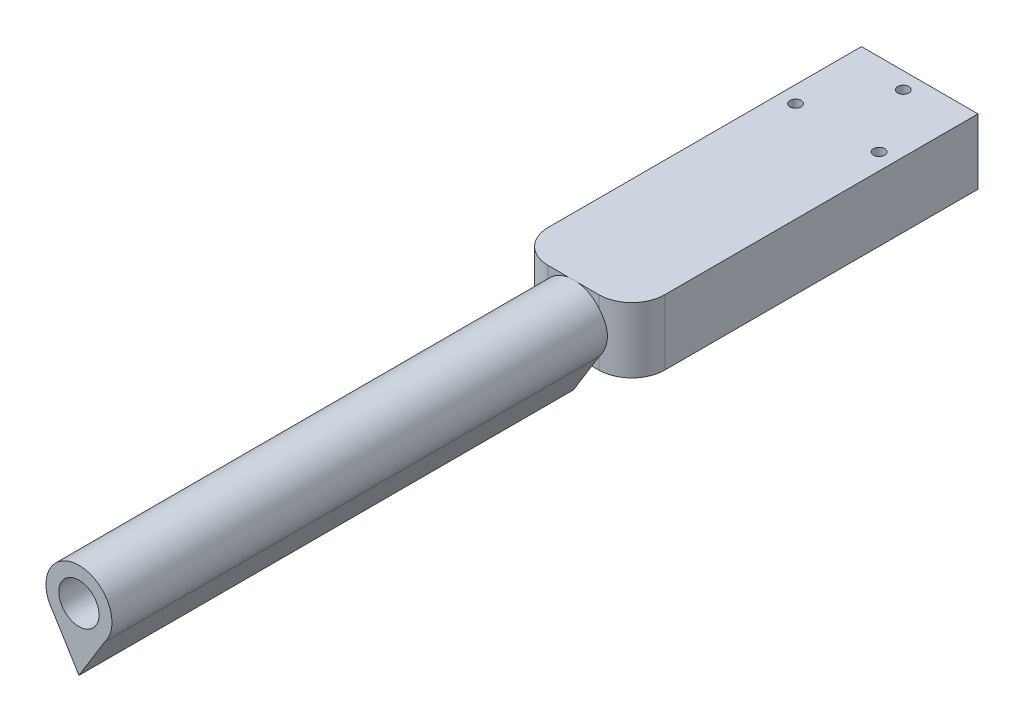
ISO-10303-21;
HEADER;
FILE_DESCRIPTION(('STEP AP214'),'2;1');
FILE_NAME('part.step','',(''),(''),'','','');
FILE_SCHEMA(('AUTOMOTIVE_DESIGN { 1 0 10303 214 1 1 1 1 }'));
ENDSEC;
DATA;
#1=APPLICATION_CONTEXT('core data for automotive mechanical design processes');
#2=APPLICATION_PROTOCOL_DEFINITION('international standard','automotive_design',2000,#1);
#3=PRODUCT_CONTEXT('',#1,'mechanical');
#4=PRODUCT('Part','Part','',(#3));
#5=PRODUCT_RELATED_PRODUCT_CATEGORY('part','',(#4));
#6=PRODUCT_DEFINITION_FORMATION('','',#4);
#7=PRODUCT_DEFINITION_CONTEXT('part definition',#1,'design');
#8=PRODUCT_DEFINITION('design','',#6,#7);
#9=PRODUCT_DEFINITION_SHAPE('','',#8);
#10=(LENGTH_UNIT() NAMED_UNIT(*) SI_UNIT(.MILLI.,.METRE.));
#11=(NAMED_UNIT(*) PLANE_ANGLE_UNIT() SI_UNIT($,.RADIAN.));
#12=(NAMED_UNIT(*) SI_UNIT($,.STERADIAN.) SOLID_ANGLE_UNIT());
#13=UNCERTAINTY_MEASURE_WITH_UNIT(LENGTH_MEASURE(1.E-05),#10,'distance_accuracy_value','');
#14=(GEOMETRIC_REPRESENTATION_CONTEXT(3) GLOBAL_UNCERTAINTY_ASSIGNED_CONTEXT((#13)) GLOBAL_UNIT_ASSIGNED_CONTEXT((#10,
#11,#12)) REPRESENTATION_CONTEXT('',''));
#15=CARTESIAN_POINT('',(0.,0.,0.));
#16=DIRECTION('',(0.,0.,1.));
#17=DIRECTION('',(1.,0.,0.));
#18=AXIS2_PLACEMENT_3D('',#15,#16,#17);
#19=CARTESIAN_POINT('',(0.,0.,0.));
#20=DIRECTION('',(0.,0.,1.));
#21=DIRECTION('',(1.,0.,0.));
#22=AXIS2_PLACEMENT_3D('',#19,#20,#21);
#23=PLANE('',#22);
#24=DIRECTION('',(1.,0.,0.));
#25=VECTOR('',#24,1.);
#26=CARTESIAN_POINT('',(-17.6733997966207,-9.90054579100179,0.));
#27=LINE('',#26,#25);
#28=CARTESIAN_POINT('',(5.54031802648525,-9.90054579100179,0.));
#29=VERTEX_POINT('',#28);
#30=CARTESIAN_POINT('',(7.67339979662072,-9.90054579100179,0.));
#31=VERTEX_POINT('',#30);
#32=EDGE_CURVE('E176',#29,#31,#27,.T.);
#33=ORIENTED_EDGE('',*,*,#32,.T.);
#34=DIRECTION('',(0.,1.,0.));
#35=VECTOR('',#34,1.);
#36=CARTESIAN_POINT('',(7.67339979662073,0.,0.));
#37=LINE('',#36,#35);
#38=CARTESIAN_POINT('',(7.67339979662073,-6.42417658757995,0.));
#39=VERTEX_POINT('',#38);
#40=EDGE_CURVE('E262',#31,#39,#37,.T.);
#41=ORIENTED_EDGE('',*,*,#40,.T.);
#42=DIRECTION('',(0.522990431327219,0.852338552888563,0.));
#43=VECTOR('',#42,1.);
#44=CARTESIAN_POINT('',(0.,-18.9298250404386,0.));
#45=LINE('',#44,#43);
#46=EDGE_CURVE('E205',#29,#39,#45,.T.);
#47=ORIENTED_EDGE('',*,*,#46,.F.);
#48=EDGE_LOOP('',(#33,#41,#47));
#49=FACE_BOUND('',#48,.T.);
#50=ADVANCED_FACE('F39',(#49),#23,.T.);
#51=DIRECTION('',(-1.,0.,0.));
#52=VECTOR('',#51,1.);
#53=CARTESIAN_POINT('',(-17.6733997966207,9.90054579100179,0.));
#54=LINE('',#53,#52);
#55=CARTESIAN_POINT('',(-1.4068379580736,9.90054579100179,0.));
#56=VERTEX_POINT('',#55);
#57=CARTESIAN_POINT('',(-7.67339979662073,9.90054579100179,0.));
#58=VERTEX_POINT('',#57);
#59=EDGE_CURVE('E190',#56,#58,#54,.T.);
#60=ORIENTED_EDGE('',*,*,#59,.T.);
#61=DIRECTION('',(0.,-1.,0.));
#62=VECTOR('',#61,1.);
#63=CARTESIAN_POINT('',(-7.67339979662073,0.,0.));
#64=LINE('',#63,#62);
#65=CARTESIAN_POINT('',(-7.67339979662073,6.41240481888199,0.));
#66=VERTEX_POINT('',#65);
#67=EDGE_CURVE('E241',#58,#66,#64,.T.);
#68=ORIENTED_EDGE('',*,*,#67,.T.);
#69=CARTESIAN_POINT('',(0.,0.,0.));
#70=DIRECTION('',(0.,0.,1.));
#71=DIRECTION('',(1.,0.,0.));
#72=AXIS2_PLACEMENT_3D('',#69,#70,#71);
#73=CIRCLE('',#72,10.);
#74=EDGE_CURVE('E222',#56,#66,#73,.T.);
#75=ORIENTED_EDGE('',*,*,#74,.F.);
#76=EDGE_LOOP('',(#60,#68,#75));
#77=FACE_BOUND('',#76,.T.);
#78=ADVANCED_FACE('F302',(#77),#23,.T.);
#79=CARTESIAN_POINT('',(0.,0.,0.));
#80=DIRECTION('',(0.,0.,1.));
#81=DIRECTION('',(1.,0.,0.));
#82=AXIS2_PLACEMENT_3D('',#79,#80,#81);
#83=PLANE('',#82);
#84=CARTESIAN_POINT('',(1.4068379580736,9.90054579100179,0.));
#85=VERTEX_POINT('',#84);
#86=EDGE_CURVE('E227',#85,#56,#73,.T.);
#87=ORIENTED_EDGE('',*,*,#86,.F.);
#88=EDGE_CURVE('E191',#85,#56,#54,.T.);
#89=ORIENTED_EDGE('',*,*,#88,.T.);
#90=EDGE_LOOP('',(#87,#89));
#91=FACE_BOUND('',#90,.T.);
#92=ADVANCED_FACE('F300',(#91),#83,.F.);
#93=CARTESIAN_POINT('',(0.,0.,150.));
#94=DIRECTION('',(0.,0.,1.));
#95=DIRECTION('',(1.,0.,0.));
#96=AXIS2_PLACEMENT_3D('',#93,#94,#95);
#97=PLANE('',#96);
#98=DIRECTION('',(0.522990431327219,0.852338552888563,0.));
#99=VECTOR('',#98,1.);
#100=CARTESIAN_POINT('',(0.,-18.9298250404386,150.));
#101=LINE('',#100,#99);
#102=CARTESIAN_POINT('',(0.,-18.9298250404386,150.));
#103=VERTEX_POINT('',#102);
#104=CARTESIAN_POINT('',(7.70091379908371,-6.37933591050684,150.));
#105=VERTEX_POINT('',#104);
#106=EDGE_CURVE('E206',#103,#105,#101,.T.);
#107=ORIENTED_EDGE('',*,*,#106,.T.);
#108=CARTESIAN_POINT('',(0.,0.,150.));
#109=DIRECTION('',(0.,0.,1.));
#110=DIRECTION('',(1.,0.,0.));
#111=AXIS2_PLACEMENT_3D('',#108,#109,#110);
#112=CIRCLE('',#111,10.);
#113=CARTESIAN_POINT('',(-7.70091379908371,-6.37933591050684,150.));
#114=VERTEX_POINT('',#113);
#115=EDGE_CURVE('E210',#105,#114,#112,.T.);
#116=ORIENTED_EDGE('',*,*,#115,.T.);
#117=DIRECTION('',(0.522990431327219,-0.852338552888563,0.));
#118=VECTOR('',#117,1.);
#119=CARTESIAN_POINT('',(0.,-18.9298250404386,150.));
#120=LINE('',#119,#118);
#121=EDGE_CURVE('E214',#114,#103,#120,.T.);
#122=ORIENTED_EDGE('',*,*,#121,.T.);
#123=EDGE_LOOP('',(#107,#116,#122));
#124=FACE_BOUND('',#123,.T.);
#125=CARTESIAN_POINT('',(0.,0.,150.));
#126=DIRECTION('',(0.,0.,1.));
#127=DIRECTION('',(1.,0.,0.));
#128=AXIS2_PLACEMENT_3D('',#125,#126,#127);
#129=CIRCLE('',#128,6.1);
#130=CARTESIAN_POINT('',(6.1,0.,150.));
#131=VERTEX_POINT('',#130);
#132=EDGE_CURVE('E195',#131,#131,#129,.T.);
#133=ORIENTED_EDGE('',*,*,#132,.F.);
#134=EDGE_LOOP('',(#133));
#135=FACE_BOUND('',#134,.T.);
#136=ADVANCED_FACE('F297',(#124,#135),#97,.T.);
#137=DIRECTION('',(0.522990431327219,-0.852338552888563,0.));
#138=VECTOR('',#137,1.);
#139=CARTESIAN_POINT('',(0.,-18.9298250404386,0.));
#140=LINE('',#139,#138);
#141=CARTESIAN_POINT('',(-5.54031802648525,-9.90054579100179,0.));
#142=VERTEX_POINT('',#141);
#143=CARTESIAN_POINT('',(0.,-18.9298250404386,0.));
#144=VERTEX_POINT('',#143);
#145=EDGE_CURVE('E226',#142,#144,#140,.T.);
#146=ORIENTED_EDGE('',*,*,#145,.F.);
#147=EDGE_CURVE('E178',#142,#29,#27,.T.);
#148=ORIENTED_EDGE('',*,*,#147,.T.);
#149=EDGE_CURVE('E218',#144,#29,#45,.T.);
#150=ORIENTED_EDGE('',*,*,#149,.F.);
#151=EDGE_LOOP('',(#146,#148,#150));
#152=FACE_BOUND('',#151,.T.);
#153=ADVANCED_FACE('F290',(#152),#83,.F.);
#154=CARTESIAN_POINT('',(0.,-18.9298250404386,150.));
#155=DIRECTION('',(-0.852338552888563,0.522990431327219,0.));
#156=DIRECTION('',(-0.522990431327219,-0.852338552888563,0.));
#157=AXIS2_PLACEMENT_3D('',#154,#155,#156);
#158=PLANE('',#157);
#159=ORIENTED_EDGE('',*,*,#149,.T.);
#160=ORIENTED_EDGE('',*,*,#46,.T.);
#161=CARTESIAN_POINT('',(7.67339979662073,-6.42417658757995,-10.));
#162=DIRECTION('',(-0.852338552888563,0.522990431327219,0.));
#163=DIRECTION('',(0.522990431327219,0.852338552888563,0.));
#164=AXIS2_PLACEMENT_3D('',#161,#162,#163);
#165=ELLIPSE('',#164,19.1208087203862,10.);
#166=CARTESIAN_POINT('',(7.70091379908371,-6.37933591050684,-3.78510882081962E-05));
#167=VERTEX_POINT('',#166);
#168=EDGE_CURVE('E55',#39,#167,#165,.T.);
#169=ORIENTED_EDGE('',*,*,#168,.T.);
#170=DIRECTION('',(0.,0.,-1.));
#171=VECTOR('',#170,1.);
#172=CARTESIAN_POINT('',(7.70091379908371,-6.37933591050684,150.));
#173=LINE('',#172,#171);
#174=EDGE_CURVE('E62',#105,#167,#173,.T.);
#175=ORIENTED_EDGE('',*,*,#174,.F.);
#176=ORIENTED_EDGE('',*,*,#106,.F.);
#177=DIRECTION('',(0.,0.,-1.));
#178=VECTOR('',#177,1.);
#179=CARTESIAN_POINT('',(0.,-18.9298250404386,150.));
#180=LINE('',#179,#178);
#181=EDGE_CURVE('E217',#103,#144,#180,.T.);
#182=ORIENTED_EDGE('',*,*,#181,.T.);
#183=EDGE_LOOP('',(#159,#160,#169,#175,#176,#182));
#184=FACE_BOUND('',#183,.T.);
#185=ADVANCED_FACE('F288',(#184),#158,.F.);
#186=CARTESIAN_POINT('',(0.,0.,150.));
#187=DIRECTION('',(0.,0.,-1.));
#188=DIRECTION('',(-1.,0.,0.));
#189=AXIS2_PLACEMENT_3D('',#186,#187,#188);
#190=CYLINDRICAL_SURFACE('',#189,10.);
#191=ORIENTED_EDGE('',*,*,#174,.T.);
#192=CARTESIAN_POINT('',(7.70091379908372,-6.37933591050683,-3.78510882122295E-05));
#193=CARTESIAN_POINT('',(7.87936989339679,-6.16395895846386,-0.000554831855340775));
#194=CARTESIAN_POINT('',(8.04868272310441,-5.94112849311777,-0.00577241079100746));
#195=CARTESIAN_POINT('',(8.367906607965,-5.48233835746713,-0.0228593364600889));
#196=CARTESIAN_POINT('',(8.51782545323439,-5.24638401352326,-0.0347260021331098));
#197=CARTESIAN_POINT('',(8.79732833358648,-4.76288416023703,-0.0623701454824233));
#198=CARTESIAN_POINT('',(8.9269070163437,-4.51533562216513,-0.0781486497148308));
#199=CARTESIAN_POINT('',(9.16488864665431,-4.01032738352383,-0.111122019981691));
#200=CARTESIAN_POINT('',(9.27328973894412,-3.7528668169738,-0.12831700992));
#201=CARTESIAN_POINT('',(9.46816843174109,-3.22980785978402,-0.161881034200702));
#202=CARTESIAN_POINT('',(9.55465226887144,-2.96421180828778,-0.178250302440476));
#203=CARTESIAN_POINT('',(9.70513482505023,-2.42657673303095,-0.208271453782499));
#204=CARTESIAN_POINT('',(9.76913424907022,-2.15453791156113,-0.221923422076579));
#205=CARTESIAN_POINT('',(9.87411562045391,-1.60614482465541,-0.245014477658921));
#206=CARTESIAN_POINT('',(9.91511974177618,-1.32979498153879,-0.254457621630933));
#207=CARTESIAN_POINT('',(9.97387023729407,-0.77450480997555,-0.268157889977852));
#208=CARTESIAN_POINT('',(9.99161693096563,-0.49556451716569,-0.272415085589549));
#209=CARTESIAN_POINT('',(10.0036674195275,0.061276341905972,-0.27529483157367));
#210=CARTESIAN_POINT('',(9.998102880385,0.339173898110257,-0.273949028938083));
#211=CARTESIAN_POINT('',(9.96387605160388,0.893464377655603,-0.265832070003794));
#212=CARTESIAN_POINT('',(9.93521344376296,1.16985728021553,-0.259060838963633));
#213=CARTESIAN_POINT('',(9.85497970181812,1.71947748479808,-0.240778809714677));
#214=CARTESIAN_POINT('',(9.80338066664673,1.99270051419057,-0.229262240278646));
#215=CARTESIAN_POINT('',(9.67767294047554,2.53372747666002,-0.202704037465773));
#216=CARTESIAN_POINT('',(9.60356498212027,2.80153158581524,-0.18766251882639));
#217=CARTESIAN_POINT('',(9.43379780629884,3.32862501218196,-0.155792933144531));
#218=CARTESIAN_POINT('',(9.33824782183939,3.58795010972474,-0.138974142215204));
#219=CARTESIAN_POINT('',(9.12599502324338,4.09786384574218,-0.105481128038567));
#220=CARTESIAN_POINT('',(9.00928842124407,4.34845091017192,-0.0888069312403349));
#221=CARTESIAN_POINT('',(8.75577896655061,4.83862594139299,-0.0579318510528613));
#222=CARTESIAN_POINT('',(8.61902529683081,5.0782389952485,-0.0437250953490678));
#223=CARTESIAN_POINT('',(8.32612241338853,5.54541240985072,-0.0202451259145894));
#224=CARTESIAN_POINT('',(8.16998659365909,5.77298094052773,-0.0109685283636447));
#225=CARTESIAN_POINT('',(7.95136170719111,6.06496377335967,-0.00372140463528704));
#226=CARTESIAN_POINT('',(7.89704895421227,6.13551549851941,-0.00234854669981117));
#227=CARTESIAN_POINT('',(7.78659557226856,6.27509666932411,-0.000488266956960034));
#228=CARTESIAN_POINT('',(7.73045638338249,6.34412724559906,-1.6398722680454E-07));
#229=CARTESIAN_POINT('',(7.67339979662073,6.41240481888199,0.));
#230=B_SPLINE_CURVE_WITH_KNOTS('',3,(#192,#193,#194,#195,#196,#197,#198,#199,#200,#201,#202,
#203,#204,#205,#206,#207,#208,#209,#210,#211,#212,#213,#214,#215,#216,#217,#218,#219,#220,#221,
#222,#223,#224,#225,#226,#227,#228,#229),.UNSPECIFIED.,.F.,.F.,(4,2,2,2,2,2,2,2,2,2,2,2,2,2,2,2,
2,2,4),(0.,0.838705367373265,1.67707279311276,2.51566045899176,3.35432155646335,
4.19274374167313,5.03113963682443,5.86872568557564,6.70630022869458,7.53915039973668,
8.37201204443604,9.20588960992523,10.0397400363834,10.8694352754144,11.6992792093486,
12.5271202804275,13.3543924255524,13.6215058633422,13.8884135661764),.UNSPECIFIED.);
#231=CARTESIAN_POINT('',(7.67339979662073,6.41240481888199,0.));
#232=VERTEX_POINT('',#231);
#233=EDGE_CURVE('E11',#167,#232,#230,.T.);
#234=ORIENTED_EDGE('',*,*,#233,.T.);
#235=EDGE_CURVE('E223',#232,#85,#73,.T.);
#236=ORIENTED_EDGE('',*,*,#235,.T.);
#237=ORIENTED_EDGE('',*,*,#86,.T.);
#238=ORIENTED_EDGE('',*,*,#74,.T.);
#239=CARTESIAN_POINT('',(-7.67339979662073,6.41240481888199,0.));
#240=CARTESIAN_POINT('',(-7.85271366867811,6.19787860899442,-2.54043405898275E-05));
#241=CARTESIAN_POINT('',(-8.02292666681599,5.97585959978533,-0.0048236266007803));
#242=CARTESIAN_POINT('',(-8.34402163883713,5.51861747921123,-0.0212109039748143));
#243=CARTESIAN_POINT('',(-8.49491164736829,5.28339991480256,-0.0327971253407081));
#244=CARTESIAN_POINT('',(-8.77641385661889,4.80130708961674,-0.0600132184177091));
#245=CARTESIAN_POINT('',(-8.90702156656933,4.55442926283897,-0.0756439836074375));
#246=CARTESIAN_POINT('',(-9.14712018970338,4.05068348729827,-0.108445781585897));
#247=CARTESIAN_POINT('',(-9.25660916942431,3.79381462642037,-0.125616955191504));
#248=CARTESIAN_POINT('',(-9.45371081390576,3.2718719027837,-0.159243416022915));
#249=CARTESIAN_POINT('',(-9.54133105094643,3.00680091592966,-0.175698949412325));
#250=CARTESIAN_POINT('',(-9.69413800468911,2.47012616137426,-0.205986907629425));
#251=CARTESIAN_POINT('',(-9.7593254476979,2.19852260548264,-0.219819417376266));
#252=CARTESIAN_POINT('',(-9.86672825537362,1.65089502841311,-0.243343984726015));
#253=CARTESIAN_POINT('',(-9.90896530154618,1.37487543384088,-0.253039948304487));
#254=CARTESIAN_POINT('',(-9.97021767988208,0.820138003706108,-0.267291141982786));
#255=CARTESIAN_POINT('',(-9.98923331554362,0.541420203456445,-0.271846439269816));
#256=CARTESIAN_POINT('',(-10.003847073728,-0.0153610372136702,-0.275336932677862));
#257=CARTESIAN_POINT('',(-9.99955415442203,-0.293421453867673,-0.274298278468094));
#258=CARTESIAN_POINT('',(-9.96783978646179,-0.84814729553246,-0.266767838079836));
#259=CARTESIAN_POINT('',(-9.94041801076271,-1.12481270076197,-0.260275974792329));
#260=CARTESIAN_POINT('',(-9.86262782230633,-1.67507584229644,-0.24249680084189));
#261=CARTESIAN_POINT('',(-9.81223187362381,-1.94866949256602,-0.231203736749572));
#262=CARTESIAN_POINT('',(-9.6888833006571,-2.49053166973331,-0.205011811873631));
#263=CARTESIAN_POINT('',(-9.61593142319211,-2.7588003726253,-0.190113070476315));
#264=CARTESIAN_POINT('',(-9.44849549277517,-3.28666313130244,-0.158443027343122));
#265=CARTESIAN_POINT('',(-9.35414100440342,-3.54629902545291,-0.141683290992857));
#266=CARTESIAN_POINT('',(-9.14426205827333,-4.0569295079411,-0.108192770942365));
#267=CARTESIAN_POINT('',(-9.02873384071043,-4.30792255215637,-0.0914619929177057));
#268=CARTESIAN_POINT('',(-8.77755100920772,-4.79900998326473,-0.060340799928621));
#269=CARTESIAN_POINT('',(-8.64194517011114,-5.03912899027704,-0.0459448856600405));
#270=CARTESIAN_POINT('',(-8.35130219506661,-5.50741281650832,-0.0219400791807111));
#271=CARTESIAN_POINT('',(-8.19627838591505,-5.73558568366073,-0.0123279261028899));
#272=CARTESIAN_POINT('',(-7.97878920191594,-6.02884272293705,-0.00452197257024397));
#273=CARTESIAN_POINT('',(-7.92451233314225,-6.10000986022343,-0.00300075876986735));
#274=CARTESIAN_POINT('',(-7.81410420299054,-6.24081464798752,-0.000837622218152413));
#275=CARTESIAN_POINT('',(-7.75797442125718,-6.31045344831051,-0.000195014456496192));
#276=CARTESIAN_POINT('',(-7.70091379908372,-6.37933591050683,-3.78510882113234E-05));
#277=B_SPLINE_CURVE_WITH_KNOTS('',3,(#239,#240,#241,#242,#243,#244,#245,#246,#247,#248,#249,
#250,#251,#252,#253,#254,#255,#256,#257,#258,#259,#260,#261,#262,#263,#264,#265,#266,#267,#268,
#269,#270,#271,#272,#273,#274,#275,#276),.UNSPECIFIED.,.F.,.F.,(4,2,2,2,2,2,2,2,2,2,2,2,2,2,2,2,
2,2,4),(0.,0.838384844150862,1.67641994161967,2.51464032738785,3.35293741754865,
4.19094383463766,5.0289231170316,5.86610936820531,6.70328467744087,7.53654990625777,
8.36982691774135,9.20410529826876,10.0383560590778,10.8676852884212,11.6971619241156,
12.5246555953173,13.3515844274124,13.6201045355373,13.8884151707846),.UNSPECIFIED.);
#278=CARTESIAN_POINT('',(-7.70091379908371,-6.37933591050684,-3.78510882081962E-05));
#279=VERTEX_POINT('',#278);
#280=EDGE_CURVE('E269',#66,#279,#277,.T.);
#281=ORIENTED_EDGE('',*,*,#280,.T.);
#282=DIRECTION('',(0.,0.,-1.));
#283=VECTOR('',#282,1.);
#284=CARTESIAN_POINT('',(-7.70091379908371,-6.37933591050684,150.));
#285=LINE('',#284,#283);
#286=EDGE_CURVE('E70',#114,#279,#285,.T.);
#287=ORIENTED_EDGE('',*,*,#286,.F.);
#288=ORIENTED_EDGE('',*,*,#115,.F.);
#289=EDGE_LOOP('',(#191,#234,#236,#237,#238,#281,#287,#288));
#290=FACE_BOUND('',#289,.T.);
#291=ADVANCED_FACE('F279',(#290),#190,.T.);
#292=CARTESIAN_POINT('',(0.,-18.9298250404386,150.));
#293=DIRECTION('',(0.852338552888563,0.522990431327219,0.));
#294=DIRECTION('',(-0.522990431327219,0.852338552888563,0.));
#295=AXIS2_PLACEMENT_3D('',#292,#293,#294);
#296=PLANE('',#295);
#297=ORIENTED_EDGE('',*,*,#286,.T.);
#298=CARTESIAN_POINT('',(-7.67339979662073,-6.42417658757995,-10.));
#299=DIRECTION('',(0.852338552888563,0.522990431327219,0.));
#300=DIRECTION('',(0.522990431327219,-0.852338552888563,0.));
#301=AXIS2_PLACEMENT_3D('',#298,#299,#300);
#302=ELLIPSE('',#301,19.1208087203862,10.);
#303=CARTESIAN_POINT('',(-7.67339979662073,-6.42417658757995,0.));
#304=VERTEX_POINT('',#303);
#305=EDGE_CURVE('E277',#279,#304,#302,.T.);
#306=ORIENTED_EDGE('',*,*,#305,.T.);
#307=EDGE_CURVE('E211',#304,#142,#140,.T.);
#308=ORIENTED_EDGE('',*,*,#307,.T.);
#309=ORIENTED_EDGE('',*,*,#145,.T.);
#310=ORIENTED_EDGE('',*,*,#181,.F.);
#311=ORIENTED_EDGE('',*,*,#121,.F.);
#312=EDGE_LOOP('',(#297,#306,#308,#309,#310,#311));
#313=FACE_BOUND('',#312,.T.);
#314=ADVANCED_FACE('F296',(#313),#296,.F.);
#315=CARTESIAN_POINT('',(0.,0.,150.));
#316=DIRECTION('',(0.,0.,-1.));
#317=DIRECTION('',(-1.,0.,0.));
#318=AXIS2_PLACEMENT_3D('',#315,#316,#317);
#319=CYLINDRICAL_SURFACE('',#318,6.1);
#320=CARTESIAN_POINT('',(0.,-6.1,-98.3));
#321=CARTESIAN_POINT('',(0.0935574415738143,-6.09999876401496,-98.3000018753178));
#322=CARTESIAN_POINT('',(0.187134436963483,-6.09782664892021,-98.3077490368175));
#323=CARTESIAN_POINT('',(0.371582423304989,-6.08937300816777,-98.3384716806755));
#324=CARTESIAN_POINT('',(0.462452269532269,-6.08308976919173,-98.3614535121626));
#325=CARTESIAN_POINT('',(0.638797647686676,-6.06710564565073,-98.4218325382741));
#326=CARTESIAN_POINT('',(0.724280307472877,-6.05740939379312,-98.4592101989357));
#327=CARTESIAN_POINT('',(0.887764336862142,-6.03561802149456,-98.5472447345298));
#328=CARTESIAN_POINT('',(0.965765027767924,-6.02352268373472,-98.59790281259));
#329=CARTESIAN_POINT('',(1.11403096453056,-5.997893695038,-98.7124033388694));
#330=CARTESIAN_POINT('',(1.1840814698636,-5.98433370971813,-98.776517956963));
#331=CARTESIAN_POINT('',(1.31258816327021,-5.95746853059618,-98.91553040934));
#332=CARTESIAN_POINT('',(1.37104270831736,-5.94416337314149,-98.9904297691176));
#333=CARTESIAN_POINT('',(1.47577377687178,-5.91904181261822,-99.1506353139234));
#334=CARTESIAN_POINT('',(1.52179804298177,-5.90725846759161,-99.2361120706913));
#335=CARTESIAN_POINT('',(1.5987352886393,-5.88690414519879,-99.4139724770539));
#336=CARTESIAN_POINT('',(1.62965134251672,-5.87833251437228,-99.5063547170553));
#337=CARTESIAN_POINT('',(1.67473880873816,-5.86564491220705,-99.6930133921549));
#338=CARTESIAN_POINT('',(1.68930190951806,-5.86142492178121,-99.7871879661568));
#339=CARTESIAN_POINT('',(1.70249196474829,-5.85760807214828,-99.9767308696767));
#340=CARTESIAN_POINT('',(1.701122197117,-5.85801026200551,-100.072098949618));
#341=CARTESIAN_POINT('',(1.6827951979733,-5.86329954490944,-100.258221064578));
#342=CARTESIAN_POINT('',(1.6663176001428,-5.86804862774752,-100.349026882546));
#343=CARTESIAN_POINT('',(1.61901321395109,-5.88127481914741,-100.526530906721));
#344=CARTESIAN_POINT('',(1.58818518488922,-5.88975225004892,-100.61322875705));
#345=CARTESIAN_POINT('',(1.51267748271733,-5.90959733955092,-100.781279039991));
#346=CARTESIAN_POINT('',(1.46783409207705,-5.92099885701036,-100.862553743739));
#347=CARTESIAN_POINT('',(1.36568264478151,-5.94538993238114,-101.016590450718));
#348=CARTESIAN_POINT('',(1.30837193275219,-5.95837982833754,-101.089350635385));
#349=CARTESIAN_POINT('',(1.18048469786035,-5.98505339997079,-101.227026586442));
#350=CARTESIAN_POINT('',(1.10950699314572,-5.99874527186264,-101.291568672604));
#351=CARTESIAN_POINT('',(0.957566458832608,-6.02486514033678,-101.407914119365));
#352=CARTESIAN_POINT('',(0.876603160789776,-6.0372930775754,-101.459716881997));
#353=CARTESIAN_POINT('',(0.706376224145911,-6.0595733082762,-101.549298983083));
#354=CARTESIAN_POINT('',(0.617072335695586,-6.06941213403848,-101.587005408021));
#355=CARTESIAN_POINT('',(0.433055035462927,-6.08530845149842,-101.646759040248));
#356=CARTESIAN_POINT('',(0.338342924490669,-6.09136684833517,-101.668809996063));
#357=CARTESIAN_POINT('',(0.149382427011591,-6.0988806039577,-101.696027760885));
#358=CARTESIAN_POINT('',(0.0552125233906767,-6.10047426385633,-101.701702032919));
#359=CARTESIAN_POINT('',(-0.132735253243382,-6.09927943148481,-101.697414062012));
#360=CARTESIAN_POINT('',(-0.226513169606666,-6.09649143736979,-101.687453596602));
#361=CARTESIAN_POINT('',(-0.409167507468263,-6.08693635724217,-101.652593279577));
#362=CARTESIAN_POINT('',(-0.498103229433685,-6.08024595960608,-101.627981168877));
#363=CARTESIAN_POINT('',(-0.670571329623069,-6.06364961709281,-101.564854526183));
#364=CARTESIAN_POINT('',(-0.754103095391959,-6.05374330850474,-101.526338421631));
#365=CARTESIAN_POINT('',(-0.915327742797612,-6.03149577778719,-101.435587365542));
#366=CARTESIAN_POINT('',(-0.992862134726147,-6.01910799974126,-101.383082553881));
#367=CARTESIAN_POINT('',(-1.13819621774197,-5.99332682020297,-101.266179664159));
#368=CARTESIAN_POINT('',(-1.20599379777054,-5.97993320158794,-101.201779013835));
#369=CARTESIAN_POINT('',(-1.3321025532308,-5.953133095223,-101.060537305516));
#370=CARTESIAN_POINT('',(-1.3900544245316,-5.9397390841042,-100.983372439413));
#371=CARTESIAN_POINT('',(-1.49220050761789,-5.91490584979279,-100.820125968194));
#372=CARTESIAN_POINT('',(-1.53639524072374,-5.90346655253462,-100.734044701125));
#373=CARTESIAN_POINT('',(-1.60944449109155,-5.88397135062797,-100.555797422862));
#374=CARTESIAN_POINT('',(-1.6383837585101,-5.87589680708693,-100.463668295404));
#375=CARTESIAN_POINT('',(-1.6802763953234,-5.86405612408286,-100.275584561678));
#376=CARTESIAN_POINT('',(-1.69323431761426,-5.8602887575784,-100.179631052977));
#377=CARTESIAN_POINT('',(-1.70251726242819,-5.85759805795748,-99.9903189491928));
#378=CARTESIAN_POINT('',(-1.69942247426725,-5.85850574688487,-99.8969907992641));
#379=CARTESIAN_POINT('',(-1.67804730617856,-5.8646635311079,-99.7122434368499));
#380=CARTESIAN_POINT('',(-1.65976738779247,-5.86991349442305,-99.620824166432));
#381=CARTESIAN_POINT('',(-1.60889115186105,-5.88405909232312,-99.4432954873983));
#382=CARTESIAN_POINT('',(-1.57642845633611,-5.89292064942693,-99.3571448757365));
#383=CARTESIAN_POINT('',(-1.49821150238874,-5.91328912038955,-99.1914457659472));
#384=CARTESIAN_POINT('',(-1.4524549888924,-5.92479648299588,-99.1118983908944));
#385=CARTESIAN_POINT('',(-1.34723611756693,-5.94961853722325,-98.9589209035417));
#386=CARTESIAN_POINT('',(-1.28738299533941,-5.96297918360066,-98.8857669945389));
#387=CARTESIAN_POINT('',(-1.15639915204883,-5.98975811010165,-98.7503529710301));
#388=CARTESIAN_POINT('',(-1.08526563412856,-6.00317640371341,-98.688095566274));
#389=CARTESIAN_POINT('',(-0.931679853843253,-6.02894451961926,-98.5747643281323));
#390=CARTESIAN_POINT('',(-0.848996786987814,-6.04126094202649,-98.5239949894267));
#391=CARTESIAN_POINT('',(-0.675926632115178,-6.06306095542144,-98.4371551331154));
#392=CARTESIAN_POINT('',(-0.585544071240372,-6.07254619650785,-98.401076049099));
#393=CARTESIAN_POINT('',(-0.413037077845702,-6.08652495548136,-98.348842718551));
#394=CARTESIAN_POINT('',(-0.33158988902106,-6.09153960491489,-98.3305716097071));
#395=CARTESIAN_POINT('',(-0.166766823761603,-6.09827748098063,-98.3061501402422));
#396=CARTESIAN_POINT('',(-0.0833911794491585,-6.1000011016788,-98.2999983284605));
#397=CARTESIAN_POINT('',(0.,-6.1,-98.3));
#398=B_SPLINE_CURVE_WITH_KNOTS('',3,(#320,#321,#322,#323,#324,#325,#326,#327,#328,#329,#330,
#331,#332,#333,#334,#335,#336,#337,#338,#339,#340,#341,#342,#343,#344,#345,#346,#347,#348,#349,
#350,#351,#352,#353,#354,#355,#356,#357,#358,#359,#360,#361,#362,#363,#364,#365,#366,#367,#368,
#369,#370,#371,#372,#373,#374,#375,#376,#377,#378,#379,#380,#381,#382,#383,#384,#385,#386,#387,
#388,#389,#390,#391,#392,#393,#394,#395,#396,#397),.UNSPECIFIED.,.T.,.F.,(4,2,2,2,2,2,2,2,2,2,2,
2,2,2,2,2,2,2,2,2,2,2,2,2,2,2,2,2,2,2,2,2,2,2,2,2,2,2,4),(0.,0.280366336853867,
0.560849591374172,0.840953586364708,1.12108296590303,1.40754525523431,1.69404810433374,
1.98598998861168,2.27787244165038,2.56260373473267,2.84727645020013,3.12321320917269,
3.39917382934618,3.6784867595503,3.95785923805036,4.24722463991607,4.53660362166451,
4.82745936417657,5.11824544104397,5.39991880340432,5.68156014432283,5.95784484186234,
6.23416079735204,6.51625085362134,6.79840197839613,7.08930127428634,7.38018954534074,
7.66944431754988,7.95861666544789,8.23741198897016,8.51619883900914,8.79241392590868,
9.06867589546341,9.35375344564961,9.63890178868987,9.9308982932687,10.2227242795821,
10.4726550081635,10.7225558083007),.UNSPECIFIED.);
#399=CARTESIAN_POINT('',(0.,-6.1,-98.3));
#400=VERTEX_POINT('',#399);
#401=EDGE_CURVE('E44',#400,#400,#398,.T.);
#402=ORIENTED_EDGE('',*,*,#401,.F.);
#403=EDGE_LOOP('',(#402));
#404=FACE_BOUND('',#403,.T.);
#405=CARTESIAN_POINT('',(0.,6.1,-98.3));
#406=CARTESIAN_POINT('',(-0.0935574415738143,6.09999876401496,-98.3000018753178));
#407=CARTESIAN_POINT('',(-0.187134436963483,6.09782664892021,-98.3077490368175));
#408=CARTESIAN_POINT('',(-0.371582423304989,6.08937300816777,-98.3384716806755));
#409=CARTESIAN_POINT('',(-0.462452269532269,6.08308976919173,-98.3614535121626));
#410=CARTESIAN_POINT('',(-0.638797647686676,6.06710564565073,-98.4218325382741));
#411=CARTESIAN_POINT('',(-0.724280307472877,6.05740939379312,-98.4592101989357));
#412=CARTESIAN_POINT('',(-0.887764336862142,6.03561802149456,-98.5472447345298));
#413=CARTESIAN_POINT('',(-0.965765027767924,6.02352268373472,-98.59790281259));
#414=CARTESIAN_POINT('',(-1.11403096453056,5.997893695038,-98.7124033388694));
#415=CARTESIAN_POINT('',(-1.1840814698636,5.98433370971813,-98.776517956963));
#416=CARTESIAN_POINT('',(-1.31258816327021,5.95746853059618,-98.91553040934));
#417=CARTESIAN_POINT('',(-1.37104270831736,5.94416337314149,-98.9904297691176));
#418=CARTESIAN_POINT('',(-1.47577377687178,5.91904181261822,-99.1506353139234));
#419=CARTESIAN_POINT('',(-1.52179804298177,5.90725846759161,-99.2361120706913));
#420=CARTESIAN_POINT('',(-1.5987352886393,5.88690414519879,-99.4139724770539));
#421=CARTESIAN_POINT('',(-1.62965134251672,5.87833251437228,-99.5063547170553));
#422=CARTESIAN_POINT('',(-1.67473880873816,5.86564491220705,-99.6930133921549));
#423=CARTESIAN_POINT('',(-1.68930190951806,5.86142492178121,-99.7871879661568));
#424=CARTESIAN_POINT('',(-1.70249196474829,5.85760807214828,-99.9767308696767));
#425=CARTESIAN_POINT('',(-1.701122197117,5.85801026200551,-100.072098949618));
#426=CARTESIAN_POINT('',(-1.6827951979733,5.86329954490944,-100.258221064578));
#427=CARTESIAN_POINT('',(-1.6663176001428,5.86804862774752,-100.349026882546));
#428=CARTESIAN_POINT('',(-1.61901321395109,5.88127481914741,-100.526530906721));
#429=CARTESIAN_POINT('',(-1.58818518488922,5.88975225004892,-100.61322875705));
#430=CARTESIAN_POINT('',(-1.51267748271733,5.90959733955092,-100.781279039991));
#431=CARTESIAN_POINT('',(-1.46783409207705,5.92099885701036,-100.862553743739));
#432=CARTESIAN_POINT('',(-1.36568264478151,5.94538993238114,-101.016590450718));
#433=CARTESIAN_POINT('',(-1.30837193275219,5.95837982833754,-101.089350635385));
#434=CARTESIAN_POINT('',(-1.18048469786035,5.98505339997079,-101.227026586442));
#435=CARTESIAN_POINT('',(-1.10950699314572,5.99874527186264,-101.291568672604));
#436=CARTESIAN_POINT('',(-0.957566458832608,6.02486514033678,-101.407914119365));
#437=CARTESIAN_POINT('',(-0.876603160789776,6.0372930775754,-101.459716881997));
#438=CARTESIAN_POINT('',(-0.706376224145911,6.0595733082762,-101.549298983083));
#439=CARTESIAN_POINT('',(-0.617072335695586,6.06941213403848,-101.587005408021));
#440=CARTESIAN_POINT('',(-0.433055035462927,6.08530845149842,-101.646759040248));
#441=CARTESIAN_POINT('',(-0.338342924490669,6.09136684833517,-101.668809996063));
#442=CARTESIAN_POINT('',(-0.149382427011591,6.0988806039577,-101.696027760885));
#443=CARTESIAN_POINT('',(-0.0552125233906767,6.10047426385633,-101.701702032919));
#444=CARTESIAN_POINT('',(0.132735253243382,6.09927943148481,-101.697414062012));
#445=CARTESIAN_POINT('',(0.226513169606666,6.09649143736979,-101.687453596602));
#446=CARTESIAN_POINT('',(0.409167507468263,6.08693635724217,-101.652593279577));
#447=CARTESIAN_POINT('',(0.498103229433685,6.08024595960608,-101.627981168877));
#448=CARTESIAN_POINT('',(0.670571329623069,6.06364961709281,-101.564854526183));
#449=CARTESIAN_POINT('',(0.754103095391959,6.05374330850474,-101.526338421631));
#450=CARTESIAN_POINT('',(0.915327742797612,6.03149577778719,-101.435587365542));
#451=CARTESIAN_POINT('',(0.992862134726147,6.01910799974126,-101.383082553881));
#452=CARTESIAN_POINT('',(1.13819621774197,5.99332682020297,-101.266179664159));
#453=CARTESIAN_POINT('',(1.20599379777054,5.97993320158794,-101.201779013835));
#454=CARTESIAN_POINT('',(1.3321025532308,5.953133095223,-101.060537305516));
#455=CARTESIAN_POINT('',(1.3900544245316,5.9397390841042,-100.983372439413));
#456=CARTESIAN_POINT('',(1.49220050761789,5.91490584979279,-100.820125968194));
#457=CARTESIAN_POINT('',(1.53639524072374,5.90346655253462,-100.734044701125));
#458=CARTESIAN_POINT('',(1.60944449109155,5.88397135062797,-100.555797422862));
#459=CARTESIAN_POINT('',(1.6383837585101,5.87589680708693,-100.463668295404));
#460=CARTESIAN_POINT('',(1.6802763953234,5.86405612408286,-100.275584561678));
#461=CARTESIAN_POINT('',(1.69323431761426,5.8602887575784,-100.179631052977));
#462=CARTESIAN_POINT('',(1.70251726242819,5.85759805795748,-99.9903189491928));
#463=CARTESIAN_POINT('',(1.69942247426725,5.85850574688487,-99.8969907992641));
#464=CARTESIAN_POINT('',(1.67804730617856,5.8646635311079,-99.7122434368499));
#465=CARTESIAN_POINT('',(1.65976738779247,5.86991349442305,-99.620824166432));
#466=CARTESIAN_POINT('',(1.60889115186105,5.88405909232312,-99.4432954873983));
#467=CARTESIAN_POINT('',(1.57642845633611,5.89292064942693,-99.3571448757365));
#468=CARTESIAN_POINT('',(1.49821150238874,5.91328912038955,-99.1914457659472));
#469=CARTESIAN_POINT('',(1.4524549888924,5.92479648299588,-99.1118983908944));
#470=CARTESIAN_POINT('',(1.34723611756693,5.94961853722325,-98.9589209035417));
#471=CARTESIAN_POINT('',(1.28738299533941,5.96297918360066,-98.8857669945389));
#472=CARTESIAN_POINT('',(1.15639915204883,5.98975811010165,-98.7503529710301));
#473=CARTESIAN_POINT('',(1.08526563412856,6.00317640371341,-98.688095566274));
#474=CARTESIAN_POINT('',(0.931679853843253,6.02894451961926,-98.5747643281323));
#475=CARTESIAN_POINT('',(0.848996786987814,6.04126094202649,-98.5239949894267));
#476=CARTESIAN_POINT('',(0.675926632115178,6.06306095542144,-98.4371551331154));
#477=CARTESIAN_POINT('',(0.585544071240372,6.07254619650785,-98.401076049099));
#478=CARTESIAN_POINT('',(0.413037077845702,6.08652495548136,-98.348842718551));
#479=CARTESIAN_POINT('',(0.33158988902106,6.09153960491489,-98.3305716097071));
#480=CARTESIAN_POINT('',(0.166766823761603,6.09827748098063,-98.3061501402422));
#481=CARTESIAN_POINT('',(0.0833911794491585,6.1000011016788,-98.2999983284605));
#482=CARTESIAN_POINT('',(0.,6.1,-98.3));
#483=B_SPLINE_CURVE_WITH_KNOTS('',3,(#405,#406,#407,#408,#409,#410,#411,#412,#413,#414,#415,
#416,#417,#418,#419,#420,#421,#422,#423,#424,#425,#426,#427,#428,#429,#430,#431,#432,#433,#434,
#435,#436,#437,#438,#439,#440,#441,#442,#443,#444,#445,#446,#447,#448,#449,#450,#451,#452,#453,
#454,#455,#456,#457,#458,#459,#460,#461,#462,#463,#464,#465,#466,#467,#468,#469,#470,#471,#472,
#473,#474,#475,#476,#477,#478,#479,#480,#481,#482),.UNSPECIFIED.,.T.,.F.,(4,2,2,2,2,2,2,2,2,2,2,
2,2,2,2,2,2,2,2,2,2,2,2,2,2,2,2,2,2,2,2,2,2,2,2,2,2,2,4),(0.,0.280366336853867,
0.560849591374172,0.840953586364708,1.12108296590303,1.40754525523431,1.69404810433374,
1.98598998861168,2.27787244165038,2.56260373473267,2.84727645020013,3.12321320917269,
3.39917382934618,3.6784867595503,3.95785923805036,4.24722463991607,4.53660362166451,
4.82745936417657,5.11824544104397,5.39991880340432,5.68156014432283,5.95784484186234,
6.23416079735204,6.51625085362134,6.79840197839613,7.08930127428634,7.38018954534074,
7.66944431754988,7.95861666544789,8.23741198897016,8.51619883900914,8.79241392590868,
9.06867589546341,9.35375344564961,9.63890178868987,9.9308982932687,10.2227242795821,
10.4726550081635,10.7225558083007),.UNSPECIFIED.);
#484=CARTESIAN_POINT('',(0.,6.1,-98.3));
#485=VERTEX_POINT('',#484);
#486=EDGE_CURVE('E356',#485,#485,#483,.T.);
#487=ORIENTED_EDGE('',*,*,#486,.F.);
#488=EDGE_LOOP('',(#487));
#489=FACE_BOUND('',#488,.T.);
#490=ORIENTED_EDGE('',*,*,#132,.T.);
#491=EDGE_LOOP('',(#490));
#492=FACE_BOUND('',#491,.T.);
#493=CARTESIAN_POINT('',(0.,0.,-105.));
#494=DIRECTION('',(0.,0.,1.));
#495=DIRECTION('',(1.,0.,0.));
#496=AXIS2_PLACEMENT_3D('',#493,#494,#495);
#497=CIRCLE('',#496,6.1);
#498=CARTESIAN_POINT('',(6.1,0.,-105.));
#499=VERTEX_POINT('',#498);
#500=EDGE_CURVE('E180',#499,#499,#497,.T.);
#501=ORIENTED_EDGE('',*,*,#500,.F.);
#502=EDGE_LOOP('',(#501));
#503=FACE_BOUND('',#502,.T.);
#504=ADVANCED_FACE('F363',(#404,#489,#492,#503),#319,.F.);
#505=CARTESIAN_POINT('',(0.,0.,-105.));
#506=DIRECTION('',(0.,0.,1.));
#507=DIRECTION('',(1.,0.,0.));
#508=AXIS2_PLACEMENT_3D('',#505,#506,#507);
#509=PLANE('',#508);
#510=ORIENTED_EDGE('',*,*,#500,.T.);
#511=EDGE_LOOP('',(#510));
#512=FACE_BOUND('',#511,.T.);
#513=DIRECTION('',(0.,1.,0.));
#514=VECTOR('',#513,1.);
#515=CARTESIAN_POINT('',(17.6733997966207,9.90054579100179,-105.));
#516=LINE('',#515,#514);
#517=CARTESIAN_POINT('',(17.6733997966207,-9.90054579100179,-105.));
#518=VERTEX_POINT('',#517);
#519=CARTESIAN_POINT('',(17.6733997966207,9.90054579100179,-105.));
#520=VERTEX_POINT('',#519);
#521=EDGE_CURVE('E163',#518,#520,#516,.T.);
#522=ORIENTED_EDGE('',*,*,#521,.F.);
#523=DIRECTION('',(1.,0.,0.));
#524=VECTOR('',#523,1.);
#525=CARTESIAN_POINT('',(-17.6733997966207,-9.90054579100179,-105.));
#526=LINE('',#525,#524);
#527=CARTESIAN_POINT('',(-17.6733997966207,-9.90054579100179,-105.));
#528=VERTEX_POINT('',#527);
#529=EDGE_CURVE('E156',#528,#518,#526,.T.);
#530=ORIENTED_EDGE('',*,*,#529,.F.);
#531=DIRECTION('',(0.,-1.,0.));
#532=VECTOR('',#531,1.);
#533=CARTESIAN_POINT('',(-17.6733997966207,9.90054579100179,-105.));
#534=LINE('',#533,#532);
#535=CARTESIAN_POINT('',(-17.6733997966207,9.90054579100179,-105.));
#536=VERTEX_POINT('',#535);
#537=EDGE_CURVE('E166',#536,#528,#534,.T.);
#538=ORIENTED_EDGE('',*,*,#537,.F.);
#539=DIRECTION('',(-1.,0.,0.));
#540=VECTOR('',#539,1.);
#541=CARTESIAN_POINT('',(-17.6733997966207,9.90054579100179,-105.));
#542=LINE('',#541,#540);
#543=EDGE_CURVE('E147',#520,#536,#542,.T.);
#544=ORIENTED_EDGE('',*,*,#543,.F.);
#545=EDGE_LOOP('',(#522,#530,#538,#544));
#546=FACE_BOUND('',#545,.T.);
#547=ADVANCED_FACE('F161',(#512,#546),#509,.F.);
#548=CARTESIAN_POINT('',(-17.6733997966207,9.90054579100179,-105.));
#549=DIRECTION('',(0.,1.,0.));
#550=DIRECTION('',(0.,0.,1.));
#551=AXIS2_PLACEMENT_3D('',#548,#549,#550);
#552=PLANE('',#551);
#553=CARTESIAN_POINT('',(0.,9.90054579100179,-100.));
#554=DIRECTION('',(0.,1.,0.));
#555=DIRECTION('',(0.,0.,1.));
#556=AXIS2_PLACEMENT_3D('',#553,#554,#555);
#557=CIRCLE('',#556,1.69999999999999);
#558=CARTESIAN_POINT('',(0.,9.90054579100179,-98.3));
#559=VERTEX_POINT('',#558);
#560=EDGE_CURVE('E362',#559,#559,#557,.T.);
#561=ORIENTED_EDGE('',*,*,#560,.F.);
#562=EDGE_LOOP('',(#561));
#563=FACE_BOUND('',#562,.T.);
#564=CARTESIAN_POINT('',(-12.674841861608,9.90054579100179,-80.0029338911669));
#565=DIRECTION('',(0.,1.,0.));
#566=DIRECTION('',(0.,0.,1.));
#567=AXIS2_PLACEMENT_3D('',#564,#565,#566);
#568=CIRCLE('',#567,1.69999999999999);
#569=CARTESIAN_POINT('',(-12.674841861608,9.90054579100179,-78.3029338911669));
#570=VERTEX_POINT('',#569);
#571=EDGE_CURVE('E408',#570,#570,#568,.T.);
#572=ORIENTED_EDGE('',*,*,#571,.F.);
#573=EDGE_LOOP('',(#572));
#574=FACE_BOUND('',#573,.T.);
#575=CARTESIAN_POINT('',(12.6695023418795,9.90054579100179,-80.0029338911669));
#576=DIRECTION('',(0.,1.,0.));
#577=DIRECTION('',(0.,0.,1.));
#578=AXIS2_PLACEMENT_3D('',#575,#576,#577);
#579=CIRCLE('',#578,1.69999999999999);
#580=CARTESIAN_POINT('',(12.6695023418795,9.90054579100179,-78.3029338911669));
#581=VERTEX_POINT('',#580);
#582=EDGE_CURVE('E398',#581,#581,#579,.T.);
#583=ORIENTED_EDGE('',*,*,#582,.F.);
#584=EDGE_LOOP('',(#583));
#585=FACE_BOUND('',#584,.T.);
#586=DIRECTION('',(0.,0.,1.));
#587=VECTOR('',#586,1.);
#588=CARTESIAN_POINT('',(-17.6733997966207,9.90054579100179,-105.));
#589=LINE('',#588,#587);
#590=CARTESIAN_POINT('',(-17.6733997966207,9.90054579100179,-9.99999999999999));
#591=VERTEX_POINT('',#590);
#592=EDGE_CURVE('E155',#536,#591,#589,.T.);
#593=ORIENTED_EDGE('',*,*,#592,.T.);
#594=CARTESIAN_POINT('',(-7.67339979662073,9.90054579100179,-10.));
#595=DIRECTION('',(0.,1.,0.));
#596=DIRECTION('',(0.,0.,1.));
#597=AXIS2_PLACEMENT_3D('',#594,#595,#596);
#598=CIRCLE('',#597,10.);
#599=EDGE_CURVE('E256',#591,#58,#598,.T.);
#600=ORIENTED_EDGE('',*,*,#599,.T.);
#601=ORIENTED_EDGE('',*,*,#59,.F.);
#602=ORIENTED_EDGE('',*,*,#88,.F.);
#603=CARTESIAN_POINT('',(7.67339979662072,9.90054579100179,0.));
#604=VERTEX_POINT('',#603);
#605=EDGE_CURVE('E187',#604,#85,#54,.T.);
#606=ORIENTED_EDGE('',*,*,#605,.F.);
#607=CARTESIAN_POINT('',(7.67339979662073,9.90054579100179,-10.));
#608=DIRECTION('',(0.,1.,0.));
#609=DIRECTION('',(0.,0.,1.));
#610=AXIS2_PLACEMENT_3D('',#607,#608,#609);
#611=CIRCLE('',#610,10.);
#612=CARTESIAN_POINT('',(17.6733997966207,9.90054579100179,-9.99999999999999));
#613=VERTEX_POINT('',#612);
#614=EDGE_CURVE('E150',#604,#613,#611,.T.);
#615=ORIENTED_EDGE('',*,*,#614,.T.);
#616=DIRECTION('',(0.,0.,1.));
#617=VECTOR('',#616,1.);
#618=CARTESIAN_POINT('',(17.6733997966207,9.90054579100179,-105.));
#619=LINE('',#618,#617);
#620=EDGE_CURVE('E143',#520,#613,#619,.T.);
#621=ORIENTED_EDGE('',*,*,#620,.F.);
#622=ORIENTED_EDGE('',*,*,#543,.T.);
#623=EDGE_LOOP('',(#593,#600,#601,#602,#606,#615,#621,#622));
#624=FACE_BOUND('',#623,.T.);
#625=ADVANCED_FACE('F146',(#563,#574,#585,#624),#552,.T.);
#626=CARTESIAN_POINT('',(-17.6733997966207,9.90054579100179,-105.));
#627=DIRECTION('',(-1.,0.,0.));
#628=DIRECTION('',(0.,0.,1.));
#629=AXIS2_PLACEMENT_3D('',#626,#627,#628);
#630=PLANE('',#629);
#631=DIRECTION('',(0.,0.,1.));
#632=VECTOR('',#631,1.);
#633=CARTESIAN_POINT('',(-17.6733997966207,-9.90054579100179,-105.));
#634=LINE('',#633,#632);
#635=CARTESIAN_POINT('',(-17.6733997966207,-9.90054579100179,-9.99999999999999));
#636=VERTEX_POINT('',#635);
#637=EDGE_CURVE('E196',#528,#636,#634,.T.);
#638=ORIENTED_EDGE('',*,*,#637,.T.);
#639=DIRECTION('',(0.,-1.,0.));
#640=VECTOR('',#639,1.);
#641=CARTESIAN_POINT('',(-17.6733997966207,9.90054579100179,-9.99999999999999));
#642=LINE('',#641,#640);
#643=EDGE_CURVE('E251',#636,#591,#642,.F.);
#644=ORIENTED_EDGE('',*,*,#643,.T.);
#645=ORIENTED_EDGE('',*,*,#592,.F.);
#646=ORIENTED_EDGE('',*,*,#537,.T.);
#647=EDGE_LOOP('',(#638,#644,#645,#646));
#648=FACE_BOUND('',#647,.T.);
#649=ADVANCED_FACE('F332',(#648),#630,.T.);
#650=CARTESIAN_POINT('',(-17.6733997966207,-9.90054579100179,-105.));
#651=DIRECTION('',(0.,-1.,0.));
#652=DIRECTION('',(0.,0.,-1.));
#653=AXIS2_PLACEMENT_3D('',#650,#651,#652);
#654=PLANE('',#653);
#655=CARTESIAN_POINT('',(0.,-9.90054579100179,-100.));
#656=DIRECTION('',(0.,-1.,0.));
#657=DIRECTION('',(0.,0.,-1.));
#658=AXIS2_PLACEMENT_3D('',#655,#656,#657);
#659=CIRCLE('',#658,1.69999999999999);
#660=CARTESIAN_POINT('',(0.,-9.90054579100179,-101.7));
#661=VERTEX_POINT('',#660);
#662=EDGE_CURVE('E412',#661,#661,#659,.T.);
#663=ORIENTED_EDGE('',*,*,#662,.F.);
#664=EDGE_LOOP('',(#663));
#665=FACE_BOUND('',#664,.T.);
#666=CARTESIAN_POINT('',(-12.674841861608,-9.90054579100179,-80.0029338911669));
#667=DIRECTION('',(0.,-1.,0.));
#668=DIRECTION('',(0.,0.,-1.));
#669=AXIS2_PLACEMENT_3D('',#666,#667,#668);
#670=CIRCLE('',#669,1.69999999999999);
#671=CARTESIAN_POINT('',(-12.674841861608,-9.90054579100179,-81.7029338911669));
#672=VERTEX_POINT('',#671);
#673=EDGE_CURVE('E402',#672,#672,#670,.T.);
#674=ORIENTED_EDGE('',*,*,#673,.F.);
#675=EDGE_LOOP('',(#674));
#676=FACE_BOUND('',#675,.T.);
#677=CARTESIAN_POINT('',(12.6695023418795,-9.90054579100179,-80.0029338911669));
#678=DIRECTION('',(0.,-1.,0.));
#679=DIRECTION('',(0.,0.,-1.));
#680=AXIS2_PLACEMENT_3D('',#677,#678,#679);
#681=CIRCLE('',#680,1.69999999999999);
#682=CARTESIAN_POINT('',(12.6695023418795,-9.90054579100179,-81.7029338911669));
#683=VERTEX_POINT('',#682);
#684=EDGE_CURVE('E393',#683,#683,#681,.T.);
#685=ORIENTED_EDGE('',*,*,#684,.F.);
#686=EDGE_LOOP('',(#685));
#687=FACE_BOUND('',#686,.T.);
#688=CARTESIAN_POINT('',(-7.67339979662073,-9.90054579100179,0.));
#689=VERTEX_POINT('',#688);
#690=EDGE_CURVE('E173',#689,#142,#27,.T.);
#691=ORIENTED_EDGE('',*,*,#690,.F.);
#692=CARTESIAN_POINT('',(-7.67339979662073,-9.90054579100179,-10.));
#693=DIRECTION('',(0.,-1.,0.));
#694=DIRECTION('',(0.,0.,-1.));
#695=AXIS2_PLACEMENT_3D('',#692,#693,#694);
#696=CIRCLE('',#695,10.);
#697=EDGE_CURVE('E248',#689,#636,#696,.T.);
#698=ORIENTED_EDGE('',*,*,#697,.T.);
#699=ORIENTED_EDGE('',*,*,#637,.F.);
#700=ORIENTED_EDGE('',*,*,#529,.T.);
#701=DIRECTION('',(0.,0.,1.));
#702=VECTOR('',#701,1.);
#703=CARTESIAN_POINT('',(17.6733997966207,-9.90054579100179,-105.));
#704=LINE('',#703,#702);
#705=CARTESIAN_POINT('',(17.6733997966207,-9.90054579100179,-9.99999999999999));
#706=VERTEX_POINT('',#705);
#707=EDGE_CURVE('E171',#518,#706,#704,.T.);
#708=ORIENTED_EDGE('',*,*,#707,.T.);
#709=CARTESIAN_POINT('',(7.67339979662073,-9.90054579100179,-10.));
#710=DIRECTION('',(0.,-1.,0.));
#711=DIRECTION('',(0.,0.,-1.));
#712=AXIS2_PLACEMENT_3D('',#709,#710,#711);
#713=CIRCLE('',#712,10.);
#714=EDGE_CURVE('E245',#706,#31,#713,.T.);
#715=ORIENTED_EDGE('',*,*,#714,.T.);
#716=ORIENTED_EDGE('',*,*,#32,.F.);
#717=ORIENTED_EDGE('',*,*,#147,.F.);
#718=EDGE_LOOP('',(#691,#698,#699,#700,#708,#715,#716,#717));
#719=FACE_BOUND('',#718,.T.);
#720=ADVANCED_FACE('F320',(#665,#676,#687,#719),#654,.T.);
#721=CARTESIAN_POINT('',(17.6733997966207,9.90054579100179,-105.));
#722=DIRECTION('',(1.,0.,0.));
#723=DIRECTION('',(0.,0.,-1.));
#724=AXIS2_PLACEMENT_3D('',#721,#722,#723);
#725=PLANE('',#724);
#726=ORIENTED_EDGE('',*,*,#620,.T.);
#727=DIRECTION('',(0.,1.,0.));
#728=VECTOR('',#727,1.);
#729=CARTESIAN_POINT('',(17.6733997966207,9.90054579100179,-9.99999999999999));
#730=LINE('',#729,#728);
#731=EDGE_CURVE('E266',#613,#706,#730,.F.);
#732=ORIENTED_EDGE('',*,*,#731,.T.);
#733=ORIENTED_EDGE('',*,*,#707,.F.);
#734=ORIENTED_EDGE('',*,*,#521,.T.);
#735=EDGE_LOOP('',(#726,#732,#733,#734));
#736=FACE_BOUND('',#735,.T.);
#737=ADVANCED_FACE('F169',(#736),#725,.T.);
#738=ORIENTED_EDGE('',*,*,#307,.F.);
#739=DIRECTION('',(0.,-1.,0.));
#740=VECTOR('',#739,1.);
#741=CARTESIAN_POINT('',(-7.67339979662073,0.,0.));
#742=LINE('',#741,#740);
#743=EDGE_CURVE('E238',#304,#689,#742,.T.);
#744=ORIENTED_EDGE('',*,*,#743,.T.);
#745=ORIENTED_EDGE('',*,*,#690,.T.);
#746=EDGE_LOOP('',(#738,#744,#745));
#747=FACE_BOUND('',#746,.T.);
#748=ADVANCED_FACE('F305',(#747),#23,.T.);
#749=ORIENTED_EDGE('',*,*,#235,.F.);
#750=DIRECTION('',(0.,1.,0.));
#751=VECTOR('',#750,1.);
#752=CARTESIAN_POINT('',(7.67339979662073,0.,0.));
#753=LINE('',#752,#751);
#754=EDGE_CURVE('E259',#232,#604,#753,.T.);
#755=ORIENTED_EDGE('',*,*,#754,.T.);
#756=ORIENTED_EDGE('',*,*,#605,.T.);
#757=EDGE_LOOP('',(#749,#755,#756));
#758=FACE_BOUND('',#757,.T.);
#759=ADVANCED_FACE('F286',(#758),#23,.T.);
#760=CARTESIAN_POINT('',(-7.67339979662073,0.,-10.));
#761=DIRECTION('',(0.,-1.,0.));
#762=DIRECTION('',(0.,0.,-1.));
#763=AXIS2_PLACEMENT_3D('',#760,#761,#762);
#764=CYLINDRICAL_SURFACE('',#763,10.);
#765=ORIENTED_EDGE('',*,*,#599,.F.);
#766=ORIENTED_EDGE('',*,*,#643,.F.);
#767=ORIENTED_EDGE('',*,*,#697,.F.);
#768=ORIENTED_EDGE('',*,*,#743,.F.);
#769=ORIENTED_EDGE('',*,*,#305,.F.);
#770=ORIENTED_EDGE('',*,*,#280,.F.);
#771=ORIENTED_EDGE('',*,*,#67,.F.);
#772=EDGE_LOOP('',(#765,#766,#767,#768,#769,#770,#771));
#773=FACE_BOUND('',#772,.T.);
#774=ADVANCED_FACE('F283',(#773),#764,.T.);
#775=CARTESIAN_POINT('',(7.67339979662073,0.,-10.));
#776=DIRECTION('',(0.,1.,0.));
#777=DIRECTION('',(0.,0.,1.));
#778=AXIS2_PLACEMENT_3D('',#775,#776,#777);
#779=CYLINDRICAL_SURFACE('',#778,10.);
#780=ORIENTED_EDGE('',*,*,#714,.F.);
#781=ORIENTED_EDGE('',*,*,#731,.F.);
#782=ORIENTED_EDGE('',*,*,#614,.F.);
#783=ORIENTED_EDGE('',*,*,#754,.F.);
#784=ORIENTED_EDGE('',*,*,#233,.F.);
#785=ORIENTED_EDGE('',*,*,#168,.F.);
#786=ORIENTED_EDGE('',*,*,#40,.F.);
#787=EDGE_LOOP('',(#780,#781,#782,#783,#784,#785,#786));
#788=FACE_BOUND('',#787,.T.);
#789=ADVANCED_FACE('F41',(#788),#779,.T.);
#790=CARTESIAN_POINT('',(12.6695023418795,9.90054579100179,-80.0029338911669));
#791=DIRECTION('',(0.,1.,0.));
#792=DIRECTION('',(0.,0.,1.));
#793=AXIS2_PLACEMENT_3D('',#790,#791,#792);
#794=CYLINDRICAL_SURFACE('',#793,1.69999999999999);
#795=ORIENTED_EDGE('',*,*,#684,.T.);
#796=EDGE_LOOP('',(#795));
#797=FACE_BOUND('',#796,.T.);
#798=ORIENTED_EDGE('',*,*,#582,.T.);
#799=EDGE_LOOP('',(#798));
#800=FACE_BOUND('',#799,.T.);
#801=ADVANCED_FACE('F376',(#797,#800),#794,.F.);
#802=CARTESIAN_POINT('',(-12.674841861608,9.90054579100179,-80.0029338911669));
#803=DIRECTION('',(0.,1.,0.));
#804=DIRECTION('',(0.,0.,1.));
#805=AXIS2_PLACEMENT_3D('',#802,#803,#804);
#806=CYLINDRICAL_SURFACE('',#805,1.69999999999999);
#807=ORIENTED_EDGE('',*,*,#673,.T.);
#808=EDGE_LOOP('',(#807));
#809=FACE_BOUND('',#808,.T.);
#810=ORIENTED_EDGE('',*,*,#571,.T.);
#811=EDGE_LOOP('',(#810));
#812=FACE_BOUND('',#811,.T.);
#813=ADVANCED_FACE('F371',(#809,#812),#806,.F.);
#814=CARTESIAN_POINT('',(0.,9.90054579100179,-100.));
#815=DIRECTION('',(0.,1.,0.));
#816=DIRECTION('',(0.,0.,1.));
#817=AXIS2_PLACEMENT_3D('',#814,#815,#816);
#818=CYLINDRICAL_SURFACE('',#817,1.69999999999999);
#819=ORIENTED_EDGE('',*,*,#486,.T.);
#820=EDGE_LOOP('',(#819));
#821=FACE_BOUND('',#820,.T.);
#822=ORIENTED_EDGE('',*,*,#560,.T.);
#823=EDGE_LOOP('',(#822));
#824=FACE_BOUND('',#823,.T.);
#825=ADVANCED_FACE('F366',(#821,#824),#818,.F.);
#826=ORIENTED_EDGE('',*,*,#662,.T.);
#827=EDGE_LOOP('',(#826));
#828=FACE_BOUND('',#827,.T.);
#829=ORIENTED_EDGE('',*,*,#401,.T.);
#830=EDGE_LOOP('',(#829));
#831=FACE_BOUND('',#830,.T.);
#832=ADVANCED_FACE('F370',(#828,#831),#818,.F.);
#833=CLOSED_SHELL('',(#50,#78,#92,#136,#153,#185,#291,#314,#504,#547,#625,#649,#720,#737,#748,
#759,#774,#789,#801,#813,#825,#832));
#834=MANIFOLD_SOLID_BREP('B2',#833);
#835=ADVANCED_BREP_SHAPE_REPRESENTATION('',(#18,#834),#14);
#836=SHAPE_DEFINITION_REPRESENTATION(#9,#835);
ENDSEC;
END-ISO-10303-21;
